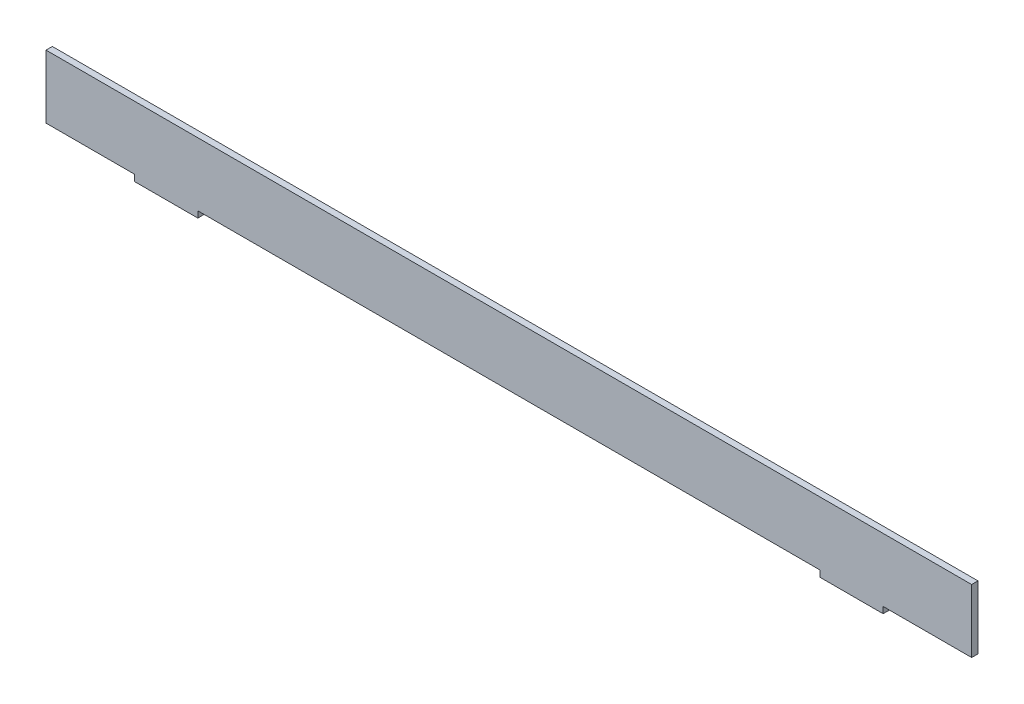
ISO-10303-21;
HEADER;
FILE_DESCRIPTION(('STEP AP214'),'2;1');
FILE_NAME('part.step','',(''),(''),'','','');
FILE_SCHEMA(('AUTOMOTIVE_DESIGN { 1 0 10303 214 1 1 1 1 }'));
ENDSEC;
DATA;
#1=APPLICATION_CONTEXT('core data for automotive mechanical design processes');
#2=APPLICATION_PROTOCOL_DEFINITION('international standard','automotive_design',2000,#1);
#3=PRODUCT_CONTEXT('',#1,'mechanical');
#4=PRODUCT('Part','Part','',(#3));
#5=PRODUCT_RELATED_PRODUCT_CATEGORY('part','',(#4));
#6=PRODUCT_DEFINITION_FORMATION('','',#4);
#7=PRODUCT_DEFINITION_CONTEXT('part definition',#1,'design');
#8=PRODUCT_DEFINITION('design','',#6,#7);
#9=PRODUCT_DEFINITION_SHAPE('','',#8);
#10=(LENGTH_UNIT() NAMED_UNIT(*) SI_UNIT(.MILLI.,.METRE.));
#11=(NAMED_UNIT(*) PLANE_ANGLE_UNIT() SI_UNIT($,.RADIAN.));
#12=(NAMED_UNIT(*) SI_UNIT($,.STERADIAN.) SOLID_ANGLE_UNIT());
#13=UNCERTAINTY_MEASURE_WITH_UNIT(LENGTH_MEASURE(1.E-05),#10,'distance_accuracy_value','');
#14=(GEOMETRIC_REPRESENTATION_CONTEXT(3) GLOBAL_UNCERTAINTY_ASSIGNED_CONTEXT((#13)) GLOBAL_UNIT_ASSIGNED_CONTEXT((#10,
#11,#12)) REPRESENTATION_CONTEXT('',''));
#15=CARTESIAN_POINT('',(0.,0.,0.));
#16=DIRECTION('',(0.,0.,1.));
#17=DIRECTION('',(1.,0.,0.));
#18=AXIS2_PLACEMENT_3D('',#15,#16,#17);
#19=CARTESIAN_POINT('',(219.5,-15.,1.5));
#20=DIRECTION('',(-1.,0.,0.));
#21=DIRECTION('',(0.,0.,1.));
#22=AXIS2_PLACEMENT_3D('',#19,#20,#21);
#23=PLANE('',#22);
#24=DIRECTION('',(0.,1.,0.));
#25=VECTOR('',#24,1.);
#26=CARTESIAN_POINT('',(219.5,-15.,-1.5));
#27=LINE('',#26,#25);
#28=CARTESIAN_POINT('',(219.5,-15.,-1.5));
#29=VERTEX_POINT('',#28);
#30=CARTESIAN_POINT('',(219.5,15.,-1.5));
#31=VERTEX_POINT('',#30);
#32=EDGE_CURVE('E163',#29,#31,#27,.T.);
#33=ORIENTED_EDGE('',*,*,#32,.T.);
#34=DIRECTION('',(0.,0.,-1.));
#35=VECTOR('',#34,1.);
#36=CARTESIAN_POINT('',(219.5,15.,1.5));
#37=LINE('',#36,#35);
#38=CARTESIAN_POINT('',(219.5,15.,1.5));
#39=VERTEX_POINT('',#38);
#40=EDGE_CURVE('E11',#39,#31,#37,.T.);
#41=ORIENTED_EDGE('',*,*,#40,.F.);
#42=DIRECTION('',(0.,1.,0.));
#43=VECTOR('',#42,1.);
#44=CARTESIAN_POINT('',(219.5,-15.,1.5));
#45=LINE('',#44,#43);
#46=CARTESIAN_POINT('',(219.5,-15.,1.5));
#47=VERTEX_POINT('',#46);
#48=EDGE_CURVE('E197',#47,#39,#45,.T.);
#49=ORIENTED_EDGE('',*,*,#48,.F.);
#50=DIRECTION('',(0.,0.,-1.));
#51=VECTOR('',#50,1.);
#52=CARTESIAN_POINT('',(219.5,-15.,1.5));
#53=LINE('',#52,#51);
#54=EDGE_CURVE('E159',#47,#29,#53,.T.);
#55=ORIENTED_EDGE('',*,*,#54,.T.);
#56=EDGE_LOOP('',(#33,#41,#49,#55));
#57=FACE_BOUND('',#56,.T.);
#58=ADVANCED_FACE('F37',(#57),#23,.F.);
#59=CARTESIAN_POINT('',(-219.5,15.,1.5));
#60=DIRECTION('',(0.,-1.,0.));
#61=DIRECTION('',(1.,0.,0.));
#62=AXIS2_PLACEMENT_3D('',#59,#60,#61);
#63=PLANE('',#62);
#64=DIRECTION('',(-1.,0.,0.));
#65=VECTOR('',#64,1.);
#66=CARTESIAN_POINT('',(-219.5,15.,-1.5));
#67=LINE('',#66,#65);
#68=CARTESIAN_POINT('',(-219.5,15.,-1.5));
#69=VERTEX_POINT('',#68);
#70=EDGE_CURVE('E167',#31,#69,#67,.T.);
#71=ORIENTED_EDGE('',*,*,#70,.T.);
#72=DIRECTION('',(0.,0.,-1.));
#73=VECTOR('',#72,1.);
#74=CARTESIAN_POINT('',(-219.5,15.,1.5));
#75=LINE('',#74,#73);
#76=CARTESIAN_POINT('',(-219.5,15.,1.5));
#77=VERTEX_POINT('',#76);
#78=EDGE_CURVE('E46',#77,#69,#75,.T.);
#79=ORIENTED_EDGE('',*,*,#78,.F.);
#80=DIRECTION('',(-1.,0.,0.));
#81=VECTOR('',#80,1.);
#82=CARTESIAN_POINT('',(-219.5,15.,1.5));
#83=LINE('',#82,#81);
#84=EDGE_CURVE('E109',#39,#77,#83,.T.);
#85=ORIENTED_EDGE('',*,*,#84,.F.);
#86=ORIENTED_EDGE('',*,*,#40,.T.);
#87=EDGE_LOOP('',(#71,#79,#85,#86));
#88=FACE_BOUND('',#87,.T.);
#89=ADVANCED_FACE('F298',(#88),#63,.F.);
#90=CARTESIAN_POINT('',(-219.5,-15.,1.5));
#91=DIRECTION('',(1.,0.,0.));
#92=DIRECTION('',(0.,0.,-1.));
#93=AXIS2_PLACEMENT_3D('',#90,#91,#92);
#94=PLANE('',#93);
#95=DIRECTION('',(0.,-1.,0.));
#96=VECTOR('',#95,1.);
#97=CARTESIAN_POINT('',(-219.5,-15.,-1.5));
#98=LINE('',#97,#96);
#99=CARTESIAN_POINT('',(-219.5,-15.,-1.5));
#100=VERTEX_POINT('',#99);
#101=EDGE_CURVE('E170',#69,#100,#98,.T.);
#102=ORIENTED_EDGE('',*,*,#101,.T.);
#103=DIRECTION('',(0.,0.,-1.));
#104=VECTOR('',#103,1.);
#105=CARTESIAN_POINT('',(-219.5,-15.,1.5));
#106=LINE('',#105,#104);
#107=CARTESIAN_POINT('',(-219.5,-15.,1.5));
#108=VERTEX_POINT('',#107);
#109=EDGE_CURVE('E224',#108,#100,#106,.T.);
#110=ORIENTED_EDGE('',*,*,#109,.F.);
#111=DIRECTION('',(0.,-1.,0.));
#112=VECTOR('',#111,1.);
#113=CARTESIAN_POINT('',(-219.5,-15.,1.5));
#114=LINE('',#113,#112);
#115=EDGE_CURVE('E235',#77,#108,#114,.T.);
#116=ORIENTED_EDGE('',*,*,#115,.F.);
#117=ORIENTED_EDGE('',*,*,#78,.T.);
#118=EDGE_LOOP('',(#102,#110,#116,#117));
#119=FACE_BOUND('',#118,.T.);
#120=ADVANCED_FACE('F233',(#119),#94,.F.);
#121=CARTESIAN_POINT('',(-219.5,-15.,1.5));
#122=DIRECTION('',(0.,1.,0.));
#123=DIRECTION('',(0.,0.,1.));
#124=AXIS2_PLACEMENT_3D('',#121,#122,#123);
#125=PLANE('',#124);
#126=DIRECTION('',(1.,0.,0.));
#127=VECTOR('',#126,1.);
#128=CARTESIAN_POINT('',(-219.5,-15.,-1.5));
#129=LINE('',#128,#127);
#130=CARTESIAN_POINT('',(-177.5,-15.,-1.5));
#131=VERTEX_POINT('',#130);
#132=EDGE_CURVE('E173',#100,#131,#129,.T.);
#133=ORIENTED_EDGE('',*,*,#132,.T.);
#134=DIRECTION('',(0.,0.,-1.));
#135=VECTOR('',#134,1.);
#136=CARTESIAN_POINT('',(-177.5,-15.,1.5));
#137=LINE('',#136,#135);
#138=CARTESIAN_POINT('',(-177.5,-15.,1.5));
#139=VERTEX_POINT('',#138);
#140=EDGE_CURVE('E220',#139,#131,#137,.T.);
#141=ORIENTED_EDGE('',*,*,#140,.F.);
#142=DIRECTION('',(1.,0.,0.));
#143=VECTOR('',#142,1.);
#144=CARTESIAN_POINT('',(-219.5,-15.,1.5));
#145=LINE('',#144,#143);
#146=EDGE_CURVE('E254',#108,#139,#145,.T.);
#147=ORIENTED_EDGE('',*,*,#146,.F.);
#148=ORIENTED_EDGE('',*,*,#109,.T.);
#149=EDGE_LOOP('',(#133,#141,#147,#148));
#150=FACE_BOUND('',#149,.T.);
#151=ADVANCED_FACE('F244',(#150),#125,.F.);
#152=CARTESIAN_POINT('',(-177.5,-15.,1.5));
#153=DIRECTION('',(1.,0.,0.));
#154=DIRECTION('',(0.,0.,-1.));
#155=AXIS2_PLACEMENT_3D('',#152,#153,#154);
#156=PLANE('',#155);
#157=DIRECTION('',(0.,-1.,0.));
#158=VECTOR('',#157,1.);
#159=CARTESIAN_POINT('',(-177.5,-15.,-1.5));
#160=LINE('',#159,#158);
#161=CARTESIAN_POINT('',(-177.5,-18.,-1.5));
#162=VERTEX_POINT('',#161);
#163=EDGE_CURVE('E176',#131,#162,#160,.T.);
#164=ORIENTED_EDGE('',*,*,#163,.T.);
#165=DIRECTION('',(0.,0.,-1.));
#166=VECTOR('',#165,1.);
#167=CARTESIAN_POINT('',(-177.5,-18.,1.5));
#168=LINE('',#167,#166);
#169=CARTESIAN_POINT('',(-177.5,-18.,1.5));
#170=VERTEX_POINT('',#169);
#171=EDGE_CURVE('E216',#170,#162,#168,.T.);
#172=ORIENTED_EDGE('',*,*,#171,.F.);
#173=DIRECTION('',(0.,-1.,0.));
#174=VECTOR('',#173,1.);
#175=CARTESIAN_POINT('',(-177.5,-15.,1.5));
#176=LINE('',#175,#174);
#177=EDGE_CURVE('E250',#139,#170,#176,.T.);
#178=ORIENTED_EDGE('',*,*,#177,.F.);
#179=ORIENTED_EDGE('',*,*,#140,.T.);
#180=EDGE_LOOP('',(#164,#172,#178,#179));
#181=FACE_BOUND('',#180,.T.);
#182=ADVANCED_FACE('F248',(#181),#156,.F.);
#183=CARTESIAN_POINT('',(-177.5,-18.,1.5));
#184=DIRECTION('',(0.,1.,0.));
#185=DIRECTION('',(-1.,0.,0.));
#186=AXIS2_PLACEMENT_3D('',#183,#184,#185);
#187=PLANE('',#186);
#188=DIRECTION('',(1.,0.,0.));
#189=VECTOR('',#188,1.);
#190=CARTESIAN_POINT('',(-177.5,-18.,-1.5));
#191=LINE('',#190,#189);
#192=CARTESIAN_POINT('',(-147.5,-18.,-1.5));
#193=VERTEX_POINT('',#192);
#194=EDGE_CURVE('E179',#162,#193,#191,.T.);
#195=ORIENTED_EDGE('',*,*,#194,.T.);
#196=DIRECTION('',(0.,0.,-1.));
#197=VECTOR('',#196,1.);
#198=CARTESIAN_POINT('',(-147.5,-18.,1.5));
#199=LINE('',#198,#197);
#200=CARTESIAN_POINT('',(-147.5,-18.,1.5));
#201=VERTEX_POINT('',#200);
#202=EDGE_CURVE('E212',#201,#193,#199,.T.);
#203=ORIENTED_EDGE('',*,*,#202,.F.);
#204=DIRECTION('',(1.,0.,0.));
#205=VECTOR('',#204,1.);
#206=CARTESIAN_POINT('',(-177.5,-18.,1.5));
#207=LINE('',#206,#205);
#208=EDGE_CURVE('E253',#170,#201,#207,.T.);
#209=ORIENTED_EDGE('',*,*,#208,.F.);
#210=ORIENTED_EDGE('',*,*,#171,.T.);
#211=EDGE_LOOP('',(#195,#203,#209,#210));
#212=FACE_BOUND('',#211,.T.);
#213=ADVANCED_FACE('F311',(#212),#187,.F.);
#214=CARTESIAN_POINT('',(-147.5,-18.,1.5));
#215=DIRECTION('',(-1.,0.,0.));
#216=DIRECTION('',(0.,0.,1.));
#217=AXIS2_PLACEMENT_3D('',#214,#215,#216);
#218=PLANE('',#217);
#219=DIRECTION('',(0.,1.,0.));
#220=VECTOR('',#219,1.);
#221=CARTESIAN_POINT('',(-147.5,-18.,-1.5));
#222=LINE('',#221,#220);
#223=CARTESIAN_POINT('',(-147.5,-15.,-1.5));
#224=VERTEX_POINT('',#223);
#225=EDGE_CURVE('E182',#193,#224,#222,.T.);
#226=ORIENTED_EDGE('',*,*,#225,.T.);
#227=DIRECTION('',(0.,0.,-1.));
#228=VECTOR('',#227,1.);
#229=CARTESIAN_POINT('',(-147.5,-15.,1.5));
#230=LINE('',#229,#228);
#231=CARTESIAN_POINT('',(-147.5,-15.,1.5));
#232=VERTEX_POINT('',#231);
#233=EDGE_CURVE('E208',#232,#224,#230,.T.);
#234=ORIENTED_EDGE('',*,*,#233,.F.);
#235=DIRECTION('',(0.,1.,0.));
#236=VECTOR('',#235,1.);
#237=CARTESIAN_POINT('',(-147.5,-18.,1.5));
#238=LINE('',#237,#236);
#239=EDGE_CURVE('E259',#201,#232,#238,.T.);
#240=ORIENTED_EDGE('',*,*,#239,.F.);
#241=ORIENTED_EDGE('',*,*,#202,.T.);
#242=EDGE_LOOP('',(#226,#234,#240,#241));
#243=FACE_BOUND('',#242,.T.);
#244=ADVANCED_FACE('F314',(#243),#218,.F.);
#245=CARTESIAN_POINT('',(-147.5,-15.,1.5));
#246=DIRECTION('',(0.,1.,0.));
#247=DIRECTION('',(-1.,0.,0.));
#248=AXIS2_PLACEMENT_3D('',#245,#246,#247);
#249=PLANE('',#248);
#250=DIRECTION('',(1.,0.,0.));
#251=VECTOR('',#250,1.);
#252=CARTESIAN_POINT('',(-147.5,-15.,-1.5));
#253=LINE('',#252,#251);
#254=CARTESIAN_POINT('',(147.5,-15.,-1.5));
#255=VERTEX_POINT('',#254);
#256=EDGE_CURVE('E185',#224,#255,#253,.T.);
#257=ORIENTED_EDGE('',*,*,#256,.T.);
#258=DIRECTION('',(0.,0.,-1.));
#259=VECTOR('',#258,1.);
#260=CARTESIAN_POINT('',(147.5,-15.,1.5));
#261=LINE('',#260,#259);
#262=CARTESIAN_POINT('',(147.5,-15.,1.5));
#263=VERTEX_POINT('',#262);
#264=EDGE_CURVE('E204',#263,#255,#261,.T.);
#265=ORIENTED_EDGE('',*,*,#264,.F.);
#266=DIRECTION('',(1.,0.,0.));
#267=VECTOR('',#266,1.);
#268=CARTESIAN_POINT('',(-147.5,-15.,1.5));
#269=LINE('',#268,#267);
#270=EDGE_CURVE('E266',#232,#263,#269,.T.);
#271=ORIENTED_EDGE('',*,*,#270,.F.);
#272=ORIENTED_EDGE('',*,*,#233,.T.);
#273=EDGE_LOOP('',(#257,#265,#271,#272));
#274=FACE_BOUND('',#273,.T.);
#275=ADVANCED_FACE('F279',(#274),#249,.F.);
#276=CARTESIAN_POINT('',(147.5,-18.,1.5));
#277=DIRECTION('',(1.,0.,0.));
#278=DIRECTION('',(0.,0.,-1.));
#279=AXIS2_PLACEMENT_3D('',#276,#277,#278);
#280=PLANE('',#279);
#281=DIRECTION('',(0.,-1.,0.));
#282=VECTOR('',#281,1.);
#283=CARTESIAN_POINT('',(147.5,-18.,-1.5));
#284=LINE('',#283,#282);
#285=CARTESIAN_POINT('',(147.5,-18.,-1.5));
#286=VERTEX_POINT('',#285);
#287=EDGE_CURVE('E188',#255,#286,#284,.T.);
#288=ORIENTED_EDGE('',*,*,#287,.T.);
#289=DIRECTION('',(0.,0.,-1.));
#290=VECTOR('',#289,1.);
#291=CARTESIAN_POINT('',(147.5,-18.,1.5));
#292=LINE('',#291,#290);
#293=CARTESIAN_POINT('',(147.5,-18.,1.5));
#294=VERTEX_POINT('',#293);
#295=EDGE_CURVE('E151',#294,#286,#292,.T.);
#296=ORIENTED_EDGE('',*,*,#295,.F.);
#297=DIRECTION('',(0.,-1.,0.));
#298=VECTOR('',#297,1.);
#299=CARTESIAN_POINT('',(147.5,-18.,1.5));
#300=LINE('',#299,#298);
#301=EDGE_CURVE('E140',#263,#294,#300,.T.);
#302=ORIENTED_EDGE('',*,*,#301,.F.);
#303=ORIENTED_EDGE('',*,*,#264,.T.);
#304=EDGE_LOOP('',(#288,#296,#302,#303));
#305=FACE_BOUND('',#304,.T.);
#306=ADVANCED_FACE('F283',(#305),#280,.F.);
#307=CARTESIAN_POINT('',(177.5,-18.,1.5));
#308=DIRECTION('',(0.,1.,0.));
#309=DIRECTION('',(-1.,0.,0.));
#310=AXIS2_PLACEMENT_3D('',#307,#308,#309);
#311=PLANE('',#310);
#312=DIRECTION('',(1.,0.,0.));
#313=VECTOR('',#312,1.);
#314=CARTESIAN_POINT('',(177.5,-18.,-1.5));
#315=LINE('',#314,#313);
#316=CARTESIAN_POINT('',(177.5,-18.,-1.5));
#317=VERTEX_POINT('',#316);
#318=EDGE_CURVE('E149',#286,#317,#315,.T.);
#319=ORIENTED_EDGE('',*,*,#318,.T.);
#320=DIRECTION('',(0.,0.,-1.));
#321=VECTOR('',#320,1.);
#322=CARTESIAN_POINT('',(177.5,-18.,1.5));
#323=LINE('',#322,#321);
#324=CARTESIAN_POINT('',(177.5,-18.,1.5));
#325=VERTEX_POINT('',#324);
#326=EDGE_CURVE('E146',#325,#317,#323,.T.);
#327=ORIENTED_EDGE('',*,*,#326,.F.);
#328=DIRECTION('',(1.,0.,0.));
#329=VECTOR('',#328,1.);
#330=CARTESIAN_POINT('',(177.5,-18.,1.5));
#331=LINE('',#330,#329);
#332=EDGE_CURVE('E134',#294,#325,#331,.T.);
#333=ORIENTED_EDGE('',*,*,#332,.F.);
#334=ORIENTED_EDGE('',*,*,#295,.T.);
#335=EDGE_LOOP('',(#319,#327,#333,#334));
#336=FACE_BOUND('',#335,.T.);
#337=ADVANCED_FACE('F147',(#336),#311,.F.);
#338=CARTESIAN_POINT('',(177.5,-15.,1.5));
#339=DIRECTION('',(-1.,0.,0.));
#340=DIRECTION('',(0.,0.,1.));
#341=AXIS2_PLACEMENT_3D('',#338,#339,#340);
#342=PLANE('',#341);
#343=DIRECTION('',(0.,1.,0.));
#344=VECTOR('',#343,1.);
#345=CARTESIAN_POINT('',(177.5,-15.,-1.5));
#346=LINE('',#345,#344);
#347=CARTESIAN_POINT('',(177.5,-15.,-1.5));
#348=VERTEX_POINT('',#347);
#349=EDGE_CURVE('E95',#317,#348,#346,.T.);
#350=ORIENTED_EDGE('',*,*,#349,.T.);
#351=DIRECTION('',(0.,0.,-1.));
#352=VECTOR('',#351,1.);
#353=CARTESIAN_POINT('',(177.5,-15.,1.5));
#354=LINE('',#353,#352);
#355=CARTESIAN_POINT('',(177.5,-15.,1.5));
#356=VERTEX_POINT('',#355);
#357=EDGE_CURVE('E152',#356,#348,#354,.T.);
#358=ORIENTED_EDGE('',*,*,#357,.F.);
#359=DIRECTION('',(0.,1.,0.));
#360=VECTOR('',#359,1.);
#361=CARTESIAN_POINT('',(177.5,-15.,1.5));
#362=LINE('',#361,#360);
#363=EDGE_CURVE('E138',#325,#356,#362,.T.);
#364=ORIENTED_EDGE('',*,*,#363,.F.);
#365=ORIENTED_EDGE('',*,*,#326,.T.);
#366=EDGE_LOOP('',(#350,#358,#364,#365));
#367=FACE_BOUND('',#366,.T.);
#368=ADVANCED_FACE('F154',(#367),#342,.F.);
#369=CARTESIAN_POINT('',(177.5,-15.,1.5));
#370=DIRECTION('',(0.,1.,0.));
#371=DIRECTION('',(-1.,0.,0.));
#372=AXIS2_PLACEMENT_3D('',#369,#370,#371);
#373=PLANE('',#372);
#374=DIRECTION('',(1.,0.,0.));
#375=VECTOR('',#374,1.);
#376=CARTESIAN_POINT('',(177.5,-15.,-1.5));
#377=LINE('',#376,#375);
#378=EDGE_CURVE('E101',#348,#29,#377,.T.);
#379=ORIENTED_EDGE('',*,*,#378,.T.);
#380=ORIENTED_EDGE('',*,*,#54,.F.);
#381=DIRECTION('',(1.,0.,0.));
#382=VECTOR('',#381,1.);
#383=CARTESIAN_POINT('',(177.5,-15.,1.5));
#384=LINE('',#383,#382);
#385=EDGE_CURVE('E54',#356,#47,#384,.T.);
#386=ORIENTED_EDGE('',*,*,#385,.F.);
#387=ORIENTED_EDGE('',*,*,#357,.T.);
#388=EDGE_LOOP('',(#379,#380,#386,#387));
#389=FACE_BOUND('',#388,.T.);
#390=ADVANCED_FACE('F287',(#389),#373,.F.);
#391=CARTESIAN_POINT('',(0.,0.,1.5));
#392=DIRECTION('',(0.,0.,-1.));
#393=DIRECTION('',(-1.,0.,0.));
#394=AXIS2_PLACEMENT_3D('',#391,#392,#393);
#395=PLANE('',#394);
#396=ORIENTED_EDGE('',*,*,#48,.T.);
#397=ORIENTED_EDGE('',*,*,#84,.T.);
#398=ORIENTED_EDGE('',*,*,#115,.T.);
#399=ORIENTED_EDGE('',*,*,#146,.T.);
#400=ORIENTED_EDGE('',*,*,#177,.T.);
#401=ORIENTED_EDGE('',*,*,#208,.T.);
#402=ORIENTED_EDGE('',*,*,#239,.T.);
#403=ORIENTED_EDGE('',*,*,#270,.T.);
#404=ORIENTED_EDGE('',*,*,#301,.T.);
#405=ORIENTED_EDGE('',*,*,#332,.T.);
#406=ORIENTED_EDGE('',*,*,#363,.T.);
#407=ORIENTED_EDGE('',*,*,#385,.T.);
#408=EDGE_LOOP('',(#396,#397,#398,#399,#400,#401,#402,#403,#404,#405,#406,#407));
#409=FACE_BOUND('',#408,.T.);
#410=ADVANCED_FACE('F136',(#409),#395,.F.);
#411=CARTESIAN_POINT('',(0.,0.,-1.5));
#412=DIRECTION('',(0.,0.,-1.));
#413=DIRECTION('',(-1.,0.,0.));
#414=AXIS2_PLACEMENT_3D('',#411,#412,#413);
#415=PLANE('',#414);
#416=ORIENTED_EDGE('',*,*,#32,.F.);
#417=ORIENTED_EDGE('',*,*,#378,.F.);
#418=ORIENTED_EDGE('',*,*,#349,.F.);
#419=ORIENTED_EDGE('',*,*,#318,.F.);
#420=ORIENTED_EDGE('',*,*,#287,.F.);
#421=ORIENTED_EDGE('',*,*,#256,.F.);
#422=ORIENTED_EDGE('',*,*,#225,.F.);
#423=ORIENTED_EDGE('',*,*,#194,.F.);
#424=ORIENTED_EDGE('',*,*,#163,.F.);
#425=ORIENTED_EDGE('',*,*,#132,.F.);
#426=ORIENTED_EDGE('',*,*,#101,.F.);
#427=ORIENTED_EDGE('',*,*,#70,.F.);
#428=EDGE_LOOP('',(#416,#417,#418,#419,#420,#421,#422,#423,#424,#425,#426,#427));
#429=FACE_BOUND('',#428,.T.);
#430=ADVANCED_FACE('F239',(#429),#415,.T.);
#431=CLOSED_SHELL('',(#58,#89,#120,#151,#182,#213,#244,#275,#306,#337,#368,#390,#410,#430));
#432=MANIFOLD_SOLID_BREP('B2',#431);
#433=ADVANCED_BREP_SHAPE_REPRESENTATION('',(#18,#432),#14);
#434=SHAPE_DEFINITION_REPRESENTATION(#9,#433);
ENDSEC;
END-ISO-10303-21;
